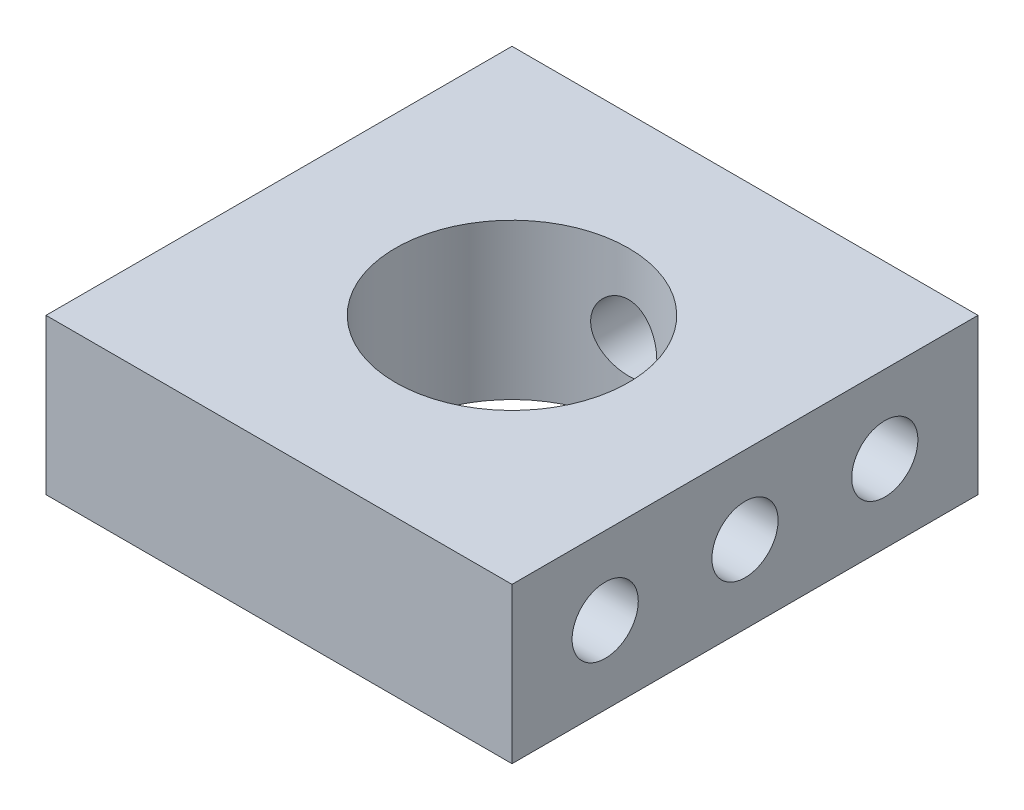
ISO-10303-21;
HEADER;
FILE_DESCRIPTION(('STEP AP214'),'2;1');
FILE_NAME('part.step','',(''),(''),'','','');
FILE_SCHEMA(('AUTOMOTIVE_DESIGN { 1 0 10303 214 1 1 1 1 }'));
ENDSEC;
DATA;
#1=APPLICATION_CONTEXT('core data for automotive mechanical design processes');
#2=APPLICATION_PROTOCOL_DEFINITION('international standard','automotive_design',2000,#1);
#3=PRODUCT_CONTEXT('',#1,'mechanical');
#4=PRODUCT('Part','Part','',(#3));
#5=PRODUCT_RELATED_PRODUCT_CATEGORY('part','',(#4));
#6=PRODUCT_DEFINITION_FORMATION('','',#4);
#7=PRODUCT_DEFINITION_CONTEXT('part definition',#1,'design');
#8=PRODUCT_DEFINITION('design','',#6,#7);
#9=PRODUCT_DEFINITION_SHAPE('','',#8);
#10=(LENGTH_UNIT() NAMED_UNIT(*) SI_UNIT(.MILLI.,.METRE.));
#11=(NAMED_UNIT(*) PLANE_ANGLE_UNIT() SI_UNIT($,.RADIAN.));
#12=(NAMED_UNIT(*) SI_UNIT($,.STERADIAN.) SOLID_ANGLE_UNIT());
#13=UNCERTAINTY_MEASURE_WITH_UNIT(LENGTH_MEASURE(1.E-05),#10,'distance_accuracy_value','');
#14=(GEOMETRIC_REPRESENTATION_CONTEXT(3) GLOBAL_UNCERTAINTY_ASSIGNED_CONTEXT((#13)) GLOBAL_UNIT_ASSIGNED_CONTEXT((#10,
#11,#12)) REPRESENTATION_CONTEXT('',''));
#15=CARTESIAN_POINT('',(0.,0.,0.));
#16=DIRECTION('',(0.,0.,1.));
#17=DIRECTION('',(1.,0.,0.));
#18=AXIS2_PLACEMENT_3D('',#15,#16,#17);
#19=CARTESIAN_POINT('',(9.525,6.35,3.94538418160373));
#20=DIRECTION('',(-1.,0.,0.));
#21=DIRECTION('',(0.,0.,1.));
#22=AXIS2_PLACEMENT_3D('',#19,#20,#21);
#23=PLANE('',#22);
#24=CARTESIAN_POINT('',(9.525,3.175,-5.715));
#25=DIRECTION('',(1.,0.,0.));
#26=DIRECTION('',(0.,0.,-1.));
#27=AXIS2_PLACEMENT_3D('',#24,#25,#26);
#28=CIRCLE('',#27,1.35254999999999);
#29=CARTESIAN_POINT('',(9.525,3.175,-7.06754999999999));
#30=VERTEX_POINT('',#29);
#31=EDGE_CURVE('E126',#30,#30,#28,.T.);
#32=ORIENTED_EDGE('',*,*,#31,.F.);
#33=EDGE_LOOP('',(#32));
#34=FACE_BOUND('',#33,.T.);
#35=CARTESIAN_POINT('',(9.525,3.175,5.715));
#36=DIRECTION('',(1.,0.,0.));
#37=DIRECTION('',(0.,0.,-1.));
#38=AXIS2_PLACEMENT_3D('',#35,#36,#37);
#39=CIRCLE('',#38,1.35254999999999);
#40=CARTESIAN_POINT('',(9.525,3.175,4.36245000000001));
#41=VERTEX_POINT('',#40);
#42=EDGE_CURVE('E134',#41,#41,#39,.T.);
#43=ORIENTED_EDGE('',*,*,#42,.F.);
#44=EDGE_LOOP('',(#43));
#45=FACE_BOUND('',#44,.T.);
#46=DIRECTION('',(0.,0.,-1.));
#47=VECTOR('',#46,1.);
#48=CARTESIAN_POINT('',(9.525,0.,3.94538418160373));
#49=LINE('',#48,#47);
#50=CARTESIAN_POINT('',(9.525,0.,9.525));
#51=VERTEX_POINT('',#50);
#52=CARTESIAN_POINT('',(9.525,0.,-9.525));
#53=VERTEX_POINT('',#52);
#54=EDGE_CURVE('E247',#51,#53,#49,.T.);
#55=ORIENTED_EDGE('',*,*,#54,.T.);
#56=DIRECTION('',(0.,-1.,0.));
#57=VECTOR('',#56,1.);
#58=CARTESIAN_POINT('',(9.525,6.35,-9.525));
#59=LINE('',#58,#57);
#60=CARTESIAN_POINT('',(9.525,6.35,-9.525));
#61=VERTEX_POINT('',#60);
#62=EDGE_CURVE('E53',#61,#53,#59,.T.);
#63=ORIENTED_EDGE('',*,*,#62,.F.);
#64=DIRECTION('',(0.,0.,-1.));
#65=VECTOR('',#64,1.);
#66=CARTESIAN_POINT('',(9.525,6.35,9.525));
#67=LINE('',#66,#65);
#68=CARTESIAN_POINT('',(9.525,6.35,9.525));
#69=VERTEX_POINT('',#68);
#70=EDGE_CURVE('E236',#69,#61,#67,.T.);
#71=ORIENTED_EDGE('',*,*,#70,.F.);
#72=DIRECTION('',(0.,-1.,0.));
#73=VECTOR('',#72,1.);
#74=CARTESIAN_POINT('',(9.525,6.35,9.525));
#75=LINE('',#74,#73);
#76=EDGE_CURVE('E11',#69,#51,#75,.T.);
#77=ORIENTED_EDGE('',*,*,#76,.T.);
#78=EDGE_LOOP('',(#55,#63,#71,#77));
#79=FACE_BOUND('',#78,.T.);
#80=CARTESIAN_POINT('',(9.525,3.175,0.));
#81=DIRECTION('',(1.,0.,0.));
#82=DIRECTION('',(0.,0.,-1.));
#83=AXIS2_PLACEMENT_3D('',#80,#81,#82);
#84=CIRCLE('',#83,1.35254999999999);
#85=CARTESIAN_POINT('',(9.525,3.175,-1.35254999999999));
#86=VERTEX_POINT('',#85);
#87=EDGE_CURVE('E142',#86,#86,#84,.T.);
#88=ORIENTED_EDGE('',*,*,#87,.F.);
#89=EDGE_LOOP('',(#88));
#90=FACE_BOUND('',#89,.T.);
#91=ADVANCED_FACE('F43',(#34,#45,#79,#90),#23,.F.);
#92=CARTESIAN_POINT('',(0.,6.35,0.));
#93=DIRECTION('',(0.,1.,0.));
#94=DIRECTION('',(0.,0.,1.));
#95=AXIS2_PLACEMENT_3D('',#92,#93,#94);
#96=PLANE('',#95);
#97=DIRECTION('',(1.,0.,0.));
#98=VECTOR('',#97,1.);
#99=CARTESIAN_POINT('',(-9.525,6.35,9.525));
#100=LINE('',#99,#98);
#101=CARTESIAN_POINT('',(-9.525,6.35,9.525));
#102=VERTEX_POINT('',#101);
#103=EDGE_CURVE('E87',#102,#69,#100,.T.);
#104=ORIENTED_EDGE('',*,*,#103,.T.);
#105=ORIENTED_EDGE('',*,*,#70,.T.);
#106=DIRECTION('',(-1.,0.,0.));
#107=VECTOR('',#106,1.);
#108=CARTESIAN_POINT('',(9.525,6.35,-9.525));
#109=LINE('',#108,#107);
#110=CARTESIAN_POINT('',(-9.525,6.35,-9.525));
#111=VERTEX_POINT('',#110);
#112=EDGE_CURVE('E239',#61,#111,#109,.T.);
#113=ORIENTED_EDGE('',*,*,#112,.T.);
#114=DIRECTION('',(0.,0.,1.));
#115=VECTOR('',#114,1.);
#116=CARTESIAN_POINT('',(-9.525,6.35,-9.525));
#117=LINE('',#116,#115);
#118=EDGE_CURVE('E61',#111,#102,#117,.T.);
#119=ORIENTED_EDGE('',*,*,#118,.T.);
#120=EDGE_LOOP('',(#104,#105,#113,#119));
#121=FACE_BOUND('',#120,.T.);
#122=CARTESIAN_POINT('',(0.,6.35,0.));
#123=DIRECTION('',(0.,1.,0.));
#124=DIRECTION('',(0.,0.,1.));
#125=AXIS2_PLACEMENT_3D('',#122,#123,#124);
#126=CIRCLE('',#125,4.7625);
#127=CARTESIAN_POINT('',(0.,6.35,4.7625));
#128=VERTEX_POINT('',#127);
#129=EDGE_CURVE('E227',#128,#128,#126,.T.);
#130=ORIENTED_EDGE('',*,*,#129,.F.);
#131=EDGE_LOOP('',(#130));
#132=FACE_BOUND('',#131,.T.);
#133=ADVANCED_FACE('F193',(#121,#132),#96,.T.);
#134=CARTESIAN_POINT('',(0.,0.,0.));
#135=DIRECTION('',(0.,1.,0.));
#136=DIRECTION('',(0.,0.,1.));
#137=AXIS2_PLACEMENT_3D('',#134,#135,#136);
#138=PLANE('',#137);
#139=DIRECTION('',(1.,0.,0.));
#140=VECTOR('',#139,1.);
#141=CARTESIAN_POINT('',(3.94538418160373,0.,9.525));
#142=LINE('',#141,#140);
#143=CARTESIAN_POINT('',(-9.525,0.,9.525));
#144=VERTEX_POINT('',#143);
#145=EDGE_CURVE('E83',#144,#51,#142,.T.);
#146=ORIENTED_EDGE('',*,*,#145,.F.);
#147=DIRECTION('',(0.,0.,1.));
#148=VECTOR('',#147,1.);
#149=CARTESIAN_POINT('',(-9.525,0.,3.94538418160374));
#150=LINE('',#149,#148);
#151=CARTESIAN_POINT('',(-9.525,0.,-9.525));
#152=VERTEX_POINT('',#151);
#153=EDGE_CURVE('E79',#152,#144,#150,.T.);
#154=ORIENTED_EDGE('',*,*,#153,.F.);
#155=DIRECTION('',(-1.,0.,0.));
#156=VECTOR('',#155,1.);
#157=CARTESIAN_POINT('',(9.525,0.,-9.525));
#158=LINE('',#157,#156);
#159=EDGE_CURVE('E250',#53,#152,#158,.T.);
#160=ORIENTED_EDGE('',*,*,#159,.F.);
#161=ORIENTED_EDGE('',*,*,#54,.F.);
#162=EDGE_LOOP('',(#146,#154,#160,#161));
#163=FACE_BOUND('',#162,.T.);
#164=CARTESIAN_POINT('',(0.,0.,0.));
#165=DIRECTION('',(0.,1.,0.));
#166=DIRECTION('',(0.,0.,1.));
#167=AXIS2_PLACEMENT_3D('',#164,#165,#166);
#168=CIRCLE('',#167,4.7625);
#169=CARTESIAN_POINT('',(0.,0.,4.7625));
#170=VERTEX_POINT('',#169);
#171=EDGE_CURVE('E226',#170,#170,#168,.T.);
#172=ORIENTED_EDGE('',*,*,#171,.T.);
#173=EDGE_LOOP('',(#172));
#174=FACE_BOUND('',#173,.T.);
#175=ADVANCED_FACE('F198',(#163,#174),#138,.F.);
#176=CARTESIAN_POINT('',(3.94538418160373,6.35,9.525));
#177=DIRECTION('',(0.,0.,-1.));
#178=DIRECTION('',(-1.,0.,0.));
#179=AXIS2_PLACEMENT_3D('',#176,#177,#178);
#180=PLANE('',#179);
#181=ORIENTED_EDGE('',*,*,#145,.T.);
#182=ORIENTED_EDGE('',*,*,#76,.F.);
#183=ORIENTED_EDGE('',*,*,#103,.F.);
#184=DIRECTION('',(0.,-1.,0.));
#185=VECTOR('',#184,1.);
#186=CARTESIAN_POINT('',(-9.525,6.35,9.525));
#187=LINE('',#186,#185);
#188=EDGE_CURVE('E244',#102,#144,#187,.T.);
#189=ORIENTED_EDGE('',*,*,#188,.T.);
#190=EDGE_LOOP('',(#181,#182,#183,#189));
#191=FACE_BOUND('',#190,.T.);
#192=ADVANCED_FACE('F45',(#191),#180,.F.);
#193=CARTESIAN_POINT('',(9.525,6.35,-9.525));
#194=DIRECTION('',(0.,0.,1.));
#195=DIRECTION('',(1.,0.,0.));
#196=AXIS2_PLACEMENT_3D('',#193,#194,#195);
#197=PLANE('',#196);
#198=CARTESIAN_POINT('',(0.,3.175,-9.525));
#199=DIRECTION('',(0.,0.,-1.));
#200=DIRECTION('',(-1.,0.,0.));
#201=AXIS2_PLACEMENT_3D('',#198,#199,#200);
#202=CIRCLE('',#201,1.35255);
#203=CARTESIAN_POINT('',(-1.35255,3.175,-9.525));
#204=VERTEX_POINT('',#203);
#205=EDGE_CURVE('E155',#204,#204,#202,.T.);
#206=ORIENTED_EDGE('',*,*,#205,.F.);
#207=EDGE_LOOP('',(#206));
#208=FACE_BOUND('',#207,.T.);
#209=ORIENTED_EDGE('',*,*,#159,.T.);
#210=DIRECTION('',(0.,-1.,0.));
#211=VECTOR('',#210,1.);
#212=CARTESIAN_POINT('',(-9.525,6.35,-9.525));
#213=LINE('',#212,#211);
#214=EDGE_CURVE('E258',#111,#152,#213,.T.);
#215=ORIENTED_EDGE('',*,*,#214,.F.);
#216=ORIENTED_EDGE('',*,*,#112,.F.);
#217=ORIENTED_EDGE('',*,*,#62,.T.);
#218=EDGE_LOOP('',(#209,#215,#216,#217));
#219=FACE_BOUND('',#218,.T.);
#220=ADVANCED_FACE('F203',(#208,#219),#197,.F.);
#221=CARTESIAN_POINT('',(-9.525,6.35,3.94538418160374));
#222=DIRECTION('',(1.,0.,0.));
#223=DIRECTION('',(0.,0.,-1.));
#224=AXIS2_PLACEMENT_3D('',#221,#222,#223);
#225=PLANE('',#224);
#226=CARTESIAN_POINT('',(-9.525,3.175,5.715));
#227=DIRECTION('',(-1.,0.,0.));
#228=DIRECTION('',(0.,0.,1.));
#229=AXIS2_PLACEMENT_3D('',#226,#227,#228);
#230=CIRCLE('',#229,1.35254999999999);
#231=CARTESIAN_POINT('',(-9.525,3.175,7.06754999999999));
#232=VERTEX_POINT('',#231);
#233=EDGE_CURVE('E113',#232,#232,#230,.T.);
#234=ORIENTED_EDGE('',*,*,#233,.F.);
#235=EDGE_LOOP('',(#234));
#236=FACE_BOUND('',#235,.T.);
#237=CARTESIAN_POINT('',(-9.525,3.175,-5.715));
#238=DIRECTION('',(-1.,0.,0.));
#239=DIRECTION('',(0.,0.,1.));
#240=AXIS2_PLACEMENT_3D('',#237,#238,#239);
#241=CIRCLE('',#240,1.35254999999999);
#242=CARTESIAN_POINT('',(-9.525,3.175,-4.36245000000001));
#243=VERTEX_POINT('',#242);
#244=EDGE_CURVE('E112',#243,#243,#241,.T.);
#245=ORIENTED_EDGE('',*,*,#244,.F.);
#246=EDGE_LOOP('',(#245));
#247=FACE_BOUND('',#246,.T.);
#248=ORIENTED_EDGE('',*,*,#153,.T.);
#249=ORIENTED_EDGE('',*,*,#188,.F.);
#250=ORIENTED_EDGE('',*,*,#118,.F.);
#251=ORIENTED_EDGE('',*,*,#214,.T.);
#252=EDGE_LOOP('',(#248,#249,#250,#251));
#253=FACE_BOUND('',#252,.T.);
#254=ADVANCED_FACE('F206',(#236,#247,#253),#225,.F.);
#255=CARTESIAN_POINT('',(0.,6.35,0.));
#256=DIRECTION('',(0.,-1.,0.));
#257=DIRECTION('',(0.,0.,-1.));
#258=AXIS2_PLACEMENT_3D('',#255,#256,#257);
#259=CYLINDRICAL_SURFACE('',#258,4.7625);
#260=CARTESIAN_POINT('',(4.56640063370485,3.175,-1.35254999999999));
#261=CARTESIAN_POINT('',(4.56640170110903,3.10068975455402,-1.35254861580889));
#262=CARTESIAN_POINT('',(4.56823438267173,3.02636546638733,-1.34640514603427));
#263=CARTESIAN_POINT('',(4.57534149984701,2.87987678755445,-1.32204854036095));
#264=CARTESIAN_POINT('',(4.58061736515387,2.80771330713241,-1.3038303907103));
#265=CARTESIAN_POINT('',(4.59396618493402,2.66768717260545,-1.2559824343459));
#266=CARTESIAN_POINT('',(4.60203484348498,2.59981810132559,-1.2263701465237));
#267=CARTESIAN_POINT('',(4.62005447292155,2.46999739220027,-1.15663082703141));
#268=CARTESIAN_POINT('',(4.63000566026733,2.40804643607575,-1.11650258599324));
#269=CARTESIAN_POINT('',(4.65098550523228,2.29006360263237,-1.02565266091116));
#270=CARTESIAN_POINT('',(4.66203525945541,2.23422441456472,-0.97468555693714));
#271=CARTESIAN_POINT('',(4.68378608654542,2.13176005069911,-0.864131554174427));
#272=CARTESIAN_POINT('',(4.69448711891384,2.08513594192282,-0.804543658559054));
#273=CARTESIAN_POINT('',(4.71457234983669,2.00160494551071,-0.677085864911765));
#274=CARTESIAN_POINT('',(4.72392877521853,1.96489210833667,-0.609084035352393));
#275=CARTESIAN_POINT('',(4.74002697829147,1.90349561110014,-0.467561913944271));
#276=CARTESIAN_POINT('',(4.74676925862135,1.8788096383192,-0.3940426862098));
#277=CARTESIAN_POINT('',(4.7567302793302,1.84279834247585,-0.245586420007764));
#278=CARTESIAN_POINT('',(4.76003546150067,1.83114466139399,-0.170734935147037));
#279=CARTESIAN_POINT('',(4.76305321988918,1.82049304957946,-0.0200711654661538));
#280=CARTESIAN_POINT('',(4.76276647492178,1.82149272757254,0.0557409351082964));
#281=CARTESIAN_POINT('',(4.75869489631409,1.83589369621008,0.203879289622465));
#282=CARTESIAN_POINT('',(4.75501024663085,1.84893982308791,0.276243250670253));
#283=CARTESIAN_POINT('',(4.74467686711358,1.88648635538632,0.417709011336021));
#284=CARTESIAN_POINT('',(4.7380279578798,1.9109874540769,0.486810613233008));
#285=CARTESIAN_POINT('',(4.72236967204045,1.9710043710628,0.620665033726602));
#286=CARTESIAN_POINT('',(4.71333547539232,2.00663677546419,0.685362555118473));
#287=CARTESIAN_POINT('',(4.6938724600643,2.0878140344687,0.807977279711239));
#288=CARTESIAN_POINT('',(4.68344333900652,2.13336103960784,0.865893007702631));
#289=CARTESIAN_POINT('',(4.66188669442927,2.23493843646873,0.975420507985117));
#290=CARTESIAN_POINT('',(4.65074749366608,2.29127767823421,1.02674391113113));
#291=CARTESIAN_POINT('',(4.62934745511477,2.41187586059605,1.1192902785718));
#292=CARTESIAN_POINT('',(4.61908668687878,2.4761354273233,1.16051244355562));
#293=CARTESIAN_POINT('',(4.6005536482296,2.61144267002226,1.23194597232205));
#294=CARTESIAN_POINT('',(4.59229752402104,2.6825394150799,1.26206888067419));
#295=CARTESIAN_POINT('',(4.57890391531724,2.82908308201907,1.30983492290815));
#296=CARTESIAN_POINT('',(4.57376553610945,2.90452874906003,1.32748163737678));
#297=CARTESIAN_POINT('',(4.56738278049193,3.05490732307405,1.34927620380854));
#298=CARTESIAN_POINT('',(4.56601316821163,3.12977202860506,1.35385838351382));
#299=CARTESIAN_POINT('',(4.56697849575813,3.27920008142574,1.350598734021));
#300=CARTESIAN_POINT('',(4.56931297991677,3.35376346465207,1.34275843300385));
#301=CARTESIAN_POINT('',(4.57730148693832,3.49872989807692,1.31526134577482));
#302=CARTESIAN_POINT('',(4.58287947907535,3.56918884533178,1.29587496560654));
#303=CARTESIAN_POINT('',(4.59664993813311,3.70585241130436,1.24614483842484));
#304=CARTESIAN_POINT('',(4.60484277908873,3.77205641975578,1.21579952373472));
#305=CARTESIAN_POINT('',(4.62316962866317,3.90012232441812,1.14416076222796));
#306=CARTESIAN_POINT('',(4.63334626609143,3.96183815926422,1.10261737496508));
#307=CARTESIAN_POINT('',(4.6543982760526,4.07758176848037,1.01006488194862));
#308=CARTESIAN_POINT('',(4.66527379783884,4.13160789266755,0.959053749847739));
#309=CARTESIAN_POINT('',(4.68693671199153,4.23229015073669,0.846987959883301));
#310=CARTESIAN_POINT('',(4.69770909864655,4.2786408031282,0.785655326387741));
#311=CARTESIAN_POINT('',(4.71758373932684,4.36039397890161,0.655832022435879));
#312=CARTESIAN_POINT('',(4.72668608096351,4.39579707666454,0.587341727770117));
#313=CARTESIAN_POINT('',(4.74213695033473,4.45431304097172,0.44562283460629));
#314=CARTESIAN_POINT('',(4.74850625117361,4.47751893044617,0.372435022288982));
#315=CARTESIAN_POINT('',(4.75786512178737,4.51123791470285,0.222987788750546));
#316=CARTESIAN_POINT('',(4.76085554968583,4.5217542322688,0.14672915251611));
#317=CARTESIAN_POINT('',(4.76307323302731,4.52957147863081,-0.00385729695052099));
#318=CARTESIAN_POINT('',(4.76242732195781,4.52731779964328,-0.0781604271236372));
#319=CARTESIAN_POINT('',(4.7577378681294,4.51070866161681,-0.225286032097937));
#320=CARTESIAN_POINT('',(4.7536944846933,4.49635377005831,-0.298108576166484));
#321=CARTESIAN_POINT('',(4.74269532931058,4.45621430754866,-0.439594476876525));
#322=CARTESIAN_POINT('',(4.73576531811087,4.43053071916091,-0.508288619761361));
#323=CARTESIAN_POINT('',(4.71971292383407,4.36855274042241,-0.640430762275762));
#324=CARTESIAN_POINT('',(4.71059020407157,4.33225672037148,-0.703877954235129));
#325=CARTESIAN_POINT('',(4.69078488561701,4.24884071316122,-0.82575430619519));
#326=CARTESIAN_POINT('',(4.68006424771654,4.20143332994458,-0.883980546503699));
#327=CARTESIAN_POINT('',(4.65840821299416,4.09767131241393,-0.991801184959506));
#328=CARTESIAN_POINT('',(4.64747275784621,4.04131421785626,-1.04139320170823));
#329=CARTESIAN_POINT('',(4.626295757259,3.91950095679387,-1.13181737034728));
#330=CARTESIAN_POINT('',(4.61607947194611,3.85384716350096,-1.17238980416485));
#331=CARTESIAN_POINT('',(4.59787655200008,3.71636864395042,-1.2418677215508));
#332=CARTESIAN_POINT('',(4.5898886502276,3.64454745521003,-1.27077983978156));
#333=CARTESIAN_POINT('',(4.57799690640778,3.50680427643752,-1.31292098259455));
#334=CARTESIAN_POINT('',(4.57368638825519,3.44140121762872,-1.32774401138577));
#335=CARTESIAN_POINT('',(4.56788798702275,3.30900241472805,-1.34755839051794));
#336=CARTESIAN_POINT('',(4.56639967120684,3.24200691640468,-1.3525512481506));
#337=CARTESIAN_POINT('',(4.56640063370485,3.175,-1.35254999999999));
#338=B_SPLINE_CURVE_WITH_KNOTS('',3,(#260,#261,#262,#263,#264,#265,#266,#267,#268,#269,#270,
#271,#272,#273,#274,#275,#276,#277,#278,#279,#280,#281,#282,#283,#284,#285,#286,#287,#288,#289,
#290,#291,#292,#293,#294,#295,#296,#297,#298,#299,#300,#301,#302,#303,#304,#305,#306,#307,#308,
#309,#310,#311,#312,#313,#314,#315,#316,#317,#318,#319,#320,#321,#322,#323,#324,#325,#326,#327,
#328,#329,#330,#331,#332,#333,#334,#335,#336,#337),.UNSPECIFIED.,.T.,.F.,(4,2,2,2,2,2,2,2,2,2,2,
2,2,2,2,2,2,2,2,2,2,2,2,2,2,2,2,2,2,2,2,2,2,2,2,2,2,2,4),(0.,0.222683955827818,
0.445460434371463,0.667895746119747,0.890356649870891,1.11852626653287,1.34672228768602,
1.5791065058643,1.81144601982123,2.03778953600667,2.26409027767398,2.48392499482254,
2.70377301838039,2.92600556941737,3.14828637213764,3.37827786679128,3.60828755479596,
3.84009256619206,4.07183102401665,4.29577011256107,4.51968165484572,4.73854477397855,
4.95743921391211,5.18169485524017,5.40599854865826,5.63777465892272,5.86953860661723,
6.09950835682952,6.32941968908501,6.5513626580728,6.77329521973292,6.99328826883899,
7.21331511898053,7.43982454272073,7.66639634122326,7.89882776303315,8.13112674528155,
8.33195576412371,8.53275398680844),.UNSPECIFIED.);
#339=CARTESIAN_POINT('',(4.56640063370485,3.175,-1.35254999999999));
#340=VERTEX_POINT('',#339);
#341=EDGE_CURVE('E146',#340,#340,#338,.T.);
#342=ORIENTED_EDGE('',*,*,#341,.F.);
#343=EDGE_LOOP('',(#342));
#344=FACE_BOUND('',#343,.T.);
#345=CARTESIAN_POINT('',(0.,4.52755,-4.7625));
#346=CARTESIAN_POINT('',(-0.0743784999581474,4.5275486430201,-4.7624990905622));
#347=CARTESIAN_POINT('',(-0.148770997363666,4.52139427786597,-4.76074068414839));
#348=CARTESIAN_POINT('',(-0.29540104844341,4.49699047829311,-4.75389731213497));
#349=CARTESIAN_POINT('',(-0.367637754898103,4.47873635244937,-4.74881105624237));
#350=CARTESIAN_POINT('',(-0.507819372462201,4.43078329715905,-4.73587132206403));
#351=CARTESIAN_POINT('',(-0.575770075173448,4.40110021454008,-4.72802167664354));
#352=CARTESIAN_POINT('',(-0.705729564095678,4.33119378181307,-4.710377746781));
#353=CARTESIAN_POINT('',(-0.767737748085329,4.29096936497405,-4.70058326555549));
#354=CARTESIAN_POINT('',(-0.885664511249006,4.20001870977713,-4.67981587709255));
#355=CARTESIAN_POINT('',(-0.941406614739934,4.14906872941423,-4.66882075569231));
#356=CARTESIAN_POINT('',(-1.04368118906315,4.03859076612216,-4.64702871784162));
#357=CARTESIAN_POINT('',(-1.09021229789723,3.97906151685142,-4.63623183091725));
#358=CARTESIAN_POINT('',(-1.17363874376928,3.85166351744424,-4.61582763733192));
#359=CARTESIAN_POINT('',(-1.21032481599622,3.78365286087308,-4.60624815020734));
#360=CARTESIAN_POINT('',(-1.27166948775741,3.64211211694877,-4.58969276319239));
#361=CARTESIAN_POINT('',(-1.29633063999,3.56858320486075,-4.58271631079326));
#362=CARTESIAN_POINT('',(-1.3323006220351,3.42006189795207,-4.57238733366614));
#363=CARTESIAN_POINT('',(-1.34393220362154,3.34515390446938,-4.56894739365361));
#364=CARTESIAN_POINT('',(-1.35451996418055,3.1943768560357,-4.56582030437458));
#365=CARTESIAN_POINT('',(-1.35347886096571,3.11850801063768,-4.5661323504485));
#366=CARTESIAN_POINT('',(-1.33900564806272,2.97053442802031,-4.57039612187765));
#367=CARTESIAN_POINT('',(-1.32597092922696,2.89838691263082,-4.57423111302579));
#368=CARTESIAN_POINT('',(-1.28851978726118,2.75734778962324,-4.58492077482652));
#369=CARTESIAN_POINT('',(-1.26410234621991,2.688456473801,-4.59177571553807));
#370=CARTESIAN_POINT('',(-1.20427101589375,2.55488196332034,-4.60783068706061));
#371=CARTESIAN_POINT('',(-1.16872313756866,2.49026233362383,-4.61705903338387));
#372=CARTESIAN_POINT('',(-1.08773328002495,2.36776901838411,-4.63680661480737));
#373=CARTESIAN_POINT('',(-1.04228912138712,2.30989682311937,-4.64732613403455));
#374=CARTESIAN_POINT('',(-0.940794256967903,2.20027881637208,-4.66895040089115));
#375=CARTESIAN_POINT('',(-0.88441177661857,2.14884113440109,-4.68006235899327));
#376=CARTESIAN_POINT('',(-0.763683506834271,2.056083587976,-4.701270538666));
#377=CARTESIAN_POINT('',(-0.699337314715697,2.01476423546827,-4.71136670882664));
#378=CARTESIAN_POINT('',(-0.5639892213758,1.94325494809201,-4.72948235962791));
#379=CARTESIAN_POINT('',(-0.492952838256662,1.91312712835502,-4.73749017851947));
#380=CARTESIAN_POINT('',(-0.346542575324879,1.86533374841148,-4.75044281323286));
#381=CARTESIAN_POINT('',(-0.271169780302289,1.8476650859767,-4.75538839149013));
#382=CARTESIAN_POINT('',(-0.120850696904539,1.8257900941737,-4.76154131476189));
#383=CARTESIAN_POINT('',(-0.0459699308038011,1.82116553193465,-4.76286475366233));
#384=CARTESIAN_POINT('',(0.10349956640034,1.82434628148552,-4.76196150939729));
#385=CARTESIAN_POINT('',(0.178088331040754,1.8321501211997,-4.75973524667437));
#386=CARTESIAN_POINT('',(0.323320333171316,1.85962538244712,-4.75205828854765));
#387=CARTESIAN_POINT('',(0.394012520550827,1.8790578995256,-4.74667254553646));
#388=CARTESIAN_POINT('',(0.531122495891908,1.92895641763358,-4.73329318241284));
#389=CARTESIAN_POINT('',(0.597539791066201,1.95942368801873,-4.72529926228568));
#390=CARTESIAN_POINT('',(0.725796270146899,2.03126494247286,-4.70732543764485));
#391=CARTESIAN_POINT('',(0.787506578464486,2.07285900781803,-4.6973065860586));
#392=CARTESIAN_POINT('',(0.903216277264467,2.16550128896996,-4.67643766201817));
#393=CARTESIAN_POINT('',(0.957213930011425,2.21655162943405,-4.66558740308336));
#394=CARTESIAN_POINT('',(1.0577689096824,2.32861713337727,-4.64384180185687));
#395=CARTESIAN_POINT('',(1.10402970104661,2.38990082578654,-4.6329563160084));
#396=CARTESIAN_POINT('',(1.18562443626754,2.51959581025901,-4.61275127903121));
#397=CARTESIAN_POINT('',(1.22095876925182,2.58800684837768,-4.60343167214173));
#398=CARTESIAN_POINT('',(1.27943864976603,2.72972431512764,-4.58752245180626));
#399=CARTESIAN_POINT('',(1.3026495237019,2.80300205720859,-4.58091824850396));
#400=CARTESIAN_POINT('',(1.33634832071343,2.95264418491538,-4.5712025660945));
#401=CARTESIAN_POINT('',(1.34684004147844,3.02900764216698,-4.5680900444605));
#402=CARTESIAN_POINT('',(1.35456349369031,3.17959566461426,-4.56580529583762));
#403=CARTESIAN_POINT('',(1.35227511990277,3.25379379693445,-4.56649045772405));
#404=CARTESIAN_POINT('',(1.33563291667447,3.40069987613526,-4.57138541209335));
#405=CARTESIAN_POINT('',(1.32127948086557,3.47340787155346,-4.57559508958619));
#406=CARTESIAN_POINT('',(1.28120938194407,3.61457466494029,-4.58697424833289));
#407=CARTESIAN_POINT('',(1.25560725829135,3.68306855721659,-4.5941138485776));
#408=CARTESIAN_POINT('',(1.19385511761934,3.81484262392982,-4.61054579052911));
#409=CARTESIAN_POINT('',(1.15770325253401,3.87812188239307,-4.61983850935274));
#410=CARTESIAN_POINT('',(1.07447772612258,3.9999291052839,-4.63991281967711));
#411=CARTESIAN_POINT('',(1.02708281091477,4.05823115248444,-4.65073344512606));
#412=CARTESIAN_POINT('',(0.923310873670471,4.1662102271965,-4.67244141501305));
#413=CARTESIAN_POINT('',(0.866931600829682,4.21588508684919,-4.68332877551092));
#414=CARTESIAN_POINT('',(0.745075103274017,4.30644175885675,-4.70427270151549));
#415=CARTESIAN_POINT('',(0.679404116686309,4.34706990505124,-4.71430135163212));
#416=CARTESIAN_POINT('',(0.54187924853466,4.41664775838159,-4.73207848194561));
#417=CARTESIAN_POINT('',(0.47002882829272,4.44560395236433,-4.73982822802492));
#418=CARTESIAN_POINT('',(0.332182453383483,4.48782989682263,-4.751335030315));
#419=CARTESIAN_POINT('',(0.266702044494608,4.50268750874605,-4.75548935771175));
#420=CARTESIAN_POINT('',(0.134151413500937,4.52254753056349,-4.76107207516973));
#421=CARTESIAN_POINT('',(0.0670813995808878,4.52755122384977,-4.76250082021498));
#422=CARTESIAN_POINT('',(0.,4.52755,-4.7625));
#423=B_SPLINE_CURVE_WITH_KNOTS('',3,(#345,#346,#347,#348,#349,#350,#351,#352,#353,#354,#355,
#356,#357,#358,#359,#360,#361,#362,#363,#364,#365,#366,#367,#368,#369,#370,#371,#372,#373,#374,
#375,#376,#377,#378,#379,#380,#381,#382,#383,#384,#385,#386,#387,#388,#389,#390,#391,#392,#393,
#394,#395,#396,#397,#398,#399,#400,#401,#402,#403,#404,#405,#406,#407,#408,#409,#410,#411,#412,
#413,#414,#415,#416,#417,#418,#419,#420,#421,#422),.UNSPECIFIED.,.T.,.F.,(4,2,2,2,2,2,2,2,2,2,2,
2,2,2,2,2,2,2,2,2,2,2,2,2,2,2,2,2,2,2,2,2,2,2,2,2,2,2,4),(0.,0.222889294304383,
0.445865059785244,0.66853276499121,0.891223011776168,1.11912484754546,1.34706035724664,
1.5795136457763,1.81191756668119,2.03842777803386,2.26488941235131,2.48410768184065,
2.70334555890311,2.92533126990746,3.14736591748721,3.3776632797834,3.60797229178431,
3.83954111207457,4.07105225324437,4.29505113405517,4.51902348540567,4.73854523915272,
4.95809225306818,5.18235198880407,5.40666217297807,5.63821506829868,5.86975971630009,
6.10004348477564,6.33025847809252,6.55188840440896,6.77351110016065,6.99292761660176,
7.21238259274194,7.43908482813347,7.66584394760145,7.89832815072563,8.13068296884128,
8.33173130329812,8.53275345112239),.UNSPECIFIED.);
#424=CARTESIAN_POINT('',(0.,4.52755,-4.7625));
#425=VERTEX_POINT('',#424);
#426=EDGE_CURVE('E219',#425,#425,#423,.T.);
#427=ORIENTED_EDGE('',*,*,#426,.F.);
#428=EDGE_LOOP('',(#427));
#429=FACE_BOUND('',#428,.T.);
#430=ORIENTED_EDGE('',*,*,#129,.T.);
#431=EDGE_LOOP('',(#430));
#432=FACE_BOUND('',#431,.T.);
#433=ORIENTED_EDGE('',*,*,#171,.F.);
#434=EDGE_LOOP('',(#433));
#435=FACE_BOUND('',#434,.T.);
#436=ADVANCED_FACE('F210',(#344,#429,#432,#435),#259,.F.);
#437=CARTESIAN_POINT('',(0.,3.175,-9.525));
#438=DIRECTION('',(0.,0.,-1.));
#439=DIRECTION('',(-1.,0.,0.));
#440=AXIS2_PLACEMENT_3D('',#437,#438,#439);
#441=CYLINDRICAL_SURFACE('',#440,1.35255);
#442=ORIENTED_EDGE('',*,*,#205,.T.);
#443=EDGE_LOOP('',(#442));
#444=FACE_BOUND('',#443,.T.);
#445=ORIENTED_EDGE('',*,*,#426,.T.);
#446=EDGE_LOOP('',(#445));
#447=FACE_BOUND('',#446,.T.);
#448=ADVANCED_FACE('F164',(#444,#447),#441,.F.);
#449=CARTESIAN_POINT('',(9.525,3.175,0.));
#450=DIRECTION('',(1.,0.,0.));
#451=DIRECTION('',(0.,0.,-1.));
#452=AXIS2_PLACEMENT_3D('',#449,#450,#451);
#453=CYLINDRICAL_SURFACE('',#452,1.35254999999999);
#454=ORIENTED_EDGE('',*,*,#87,.T.);
#455=EDGE_LOOP('',(#454));
#456=FACE_BOUND('',#455,.T.);
#457=ORIENTED_EDGE('',*,*,#341,.T.);
#458=EDGE_LOOP('',(#457));
#459=FACE_BOUND('',#458,.T.);
#460=ADVANCED_FACE('F159',(#456,#459),#453,.F.);
#461=CARTESIAN_POINT('',(3.98769403026573,3.175,5.715));
#462=DIRECTION('',(1.,0.,0.));
#463=DIRECTION('',(0.,0.,-1.));
#464=AXIS2_PLACEMENT_3D('',#461,#462,#463);
#465=CONICAL_SURFACE('',#464,1.35255,1.02974425867665);
#466=CARTESIAN_POINT('',(3.175,3.175,5.715));
#467=VERTEX_POINT('',#466);
#468=VERTEX_LOOP('',#467);
#469=FACE_BOUND('',#468,.T.);
#470=CARTESIAN_POINT('',(3.98769403026573,3.175,5.715));
#471=DIRECTION('',(1.,0.,0.));
#472=DIRECTION('',(0.,0.,-1.));
#473=AXIS2_PLACEMENT_3D('',#470,#471,#472);
#474=CIRCLE('',#473,1.35255);
#475=CARTESIAN_POINT('',(3.98769403026573,3.175,4.36245));
#476=VERTEX_POINT('',#475);
#477=EDGE_CURVE('E138',#476,#476,#474,.T.);
#478=ORIENTED_EDGE('',*,*,#477,.T.);
#479=EDGE_LOOP('',(#478));
#480=FACE_BOUND('',#479,.T.);
#481=ADVANCED_FACE('F163',(#469,#480),#465,.F.);
#482=CARTESIAN_POINT('',(9.525,3.175,5.715));
#483=DIRECTION('',(1.,0.,0.));
#484=DIRECTION('',(0.,0.,-1.));
#485=AXIS2_PLACEMENT_3D('',#482,#483,#484);
#486=CYLINDRICAL_SURFACE('',#485,1.35254999999999);
#487=ORIENTED_EDGE('',*,*,#477,.F.);
#488=EDGE_LOOP('',(#487));
#489=FACE_BOUND('',#488,.T.);
#490=ORIENTED_EDGE('',*,*,#42,.T.);
#491=EDGE_LOOP('',(#490));
#492=FACE_BOUND('',#491,.T.);
#493=ADVANCED_FACE('F168',(#489,#492),#486,.F.);
#494=CARTESIAN_POINT('',(3.98769403026573,3.175,-5.715));
#495=DIRECTION('',(1.,0.,0.));
#496=DIRECTION('',(0.,0.,-1.));
#497=AXIS2_PLACEMENT_3D('',#494,#495,#496);
#498=CONICAL_SURFACE('',#497,1.35255,1.02974425867665);
#499=CARTESIAN_POINT('',(3.175,3.175,-5.715));
#500=VERTEX_POINT('',#499);
#501=VERTEX_LOOP('',#500);
#502=FACE_BOUND('',#501,.T.);
#503=CARTESIAN_POINT('',(3.98769403026573,3.175,-5.715));
#504=DIRECTION('',(1.,0.,0.));
#505=DIRECTION('',(0.,0.,-1.));
#506=AXIS2_PLACEMENT_3D('',#503,#504,#505);
#507=CIRCLE('',#506,1.35255);
#508=CARTESIAN_POINT('',(3.98769403026573,3.175,-7.06755));
#509=VERTEX_POINT('',#508);
#510=EDGE_CURVE('E130',#509,#509,#507,.T.);
#511=ORIENTED_EDGE('',*,*,#510,.T.);
#512=EDGE_LOOP('',(#511));
#513=FACE_BOUND('',#512,.T.);
#514=ADVANCED_FACE('F172',(#502,#513),#498,.F.);
#515=CARTESIAN_POINT('',(9.525,3.175,-5.715));
#516=DIRECTION('',(1.,0.,0.));
#517=DIRECTION('',(0.,0.,-1.));
#518=AXIS2_PLACEMENT_3D('',#515,#516,#517);
#519=CYLINDRICAL_SURFACE('',#518,1.35254999999999);
#520=ORIENTED_EDGE('',*,*,#510,.F.);
#521=EDGE_LOOP('',(#520));
#522=FACE_BOUND('',#521,.T.);
#523=ORIENTED_EDGE('',*,*,#31,.T.);
#524=EDGE_LOOP('',(#523));
#525=FACE_BOUND('',#524,.T.);
#526=ADVANCED_FACE('F176',(#522,#525),#519,.F.);
#527=CARTESIAN_POINT('',(-3.98769403026573,3.175,-5.715));
#528=DIRECTION('',(-1.,0.,0.));
#529=DIRECTION('',(0.,0.,1.));
#530=AXIS2_PLACEMENT_3D('',#527,#528,#529);
#531=CONICAL_SURFACE('',#530,1.35255,1.02974425867665);
#532=CARTESIAN_POINT('',(-3.175,3.175,-5.715));
#533=VERTEX_POINT('',#532);
#534=VERTEX_LOOP('',#533);
#535=FACE_BOUND('',#534,.T.);
#536=CARTESIAN_POINT('',(-3.98769403026573,3.175,-5.715));
#537=DIRECTION('',(-1.,0.,0.));
#538=DIRECTION('',(0.,0.,1.));
#539=AXIS2_PLACEMENT_3D('',#536,#537,#538);
#540=CIRCLE('',#539,1.35255);
#541=CARTESIAN_POINT('',(-3.98769403026573,3.175,-4.36245));
#542=VERTEX_POINT('',#541);
#543=EDGE_CURVE('E118',#542,#542,#540,.T.);
#544=ORIENTED_EDGE('',*,*,#543,.T.);
#545=EDGE_LOOP('',(#544));
#546=FACE_BOUND('',#545,.T.);
#547=ADVANCED_FACE('F180',(#535,#546),#531,.F.);
#548=CARTESIAN_POINT('',(-9.525,3.175,-5.715));
#549=DIRECTION('',(-1.,0.,0.));
#550=DIRECTION('',(0.,0.,1.));
#551=AXIS2_PLACEMENT_3D('',#548,#549,#550);
#552=CYLINDRICAL_SURFACE('',#551,1.35254999999999);
#553=ORIENTED_EDGE('',*,*,#543,.F.);
#554=EDGE_LOOP('',(#553));
#555=FACE_BOUND('',#554,.T.);
#556=ORIENTED_EDGE('',*,*,#244,.T.);
#557=EDGE_LOOP('',(#556));
#558=FACE_BOUND('',#557,.T.);
#559=ADVANCED_FACE('F105',(#555,#558),#552,.F.);
#560=CARTESIAN_POINT('',(-3.98769403026573,3.175,5.715));
#561=DIRECTION('',(-1.,0.,0.));
#562=DIRECTION('',(0.,0.,1.));
#563=AXIS2_PLACEMENT_3D('',#560,#561,#562);
#564=CONICAL_SURFACE('',#563,1.35255,1.02974425867665);
#565=CARTESIAN_POINT('',(-3.175,3.175,5.715));
#566=VERTEX_POINT('',#565);
#567=VERTEX_LOOP('',#566);
#568=FACE_BOUND('',#567,.T.);
#569=CARTESIAN_POINT('',(-3.98769403026573,3.175,5.715));
#570=DIRECTION('',(-1.,0.,0.));
#571=DIRECTION('',(0.,0.,1.));
#572=AXIS2_PLACEMENT_3D('',#569,#570,#571);
#573=CIRCLE('',#572,1.35255);
#574=CARTESIAN_POINT('',(-3.98769403026573,3.175,7.06755));
#575=VERTEX_POINT('',#574);
#576=EDGE_CURVE('E109',#575,#575,#573,.T.);
#577=ORIENTED_EDGE('',*,*,#576,.T.);
#578=EDGE_LOOP('',(#577));
#579=FACE_BOUND('',#578,.T.);
#580=ADVANCED_FACE('F101',(#568,#579),#564,.F.);
#581=CARTESIAN_POINT('',(-9.525,3.175,5.715));
#582=DIRECTION('',(-1.,0.,0.));
#583=DIRECTION('',(0.,0.,1.));
#584=AXIS2_PLACEMENT_3D('',#581,#582,#583);
#585=CYLINDRICAL_SURFACE('',#584,1.35254999999999);
#586=ORIENTED_EDGE('',*,*,#576,.F.);
#587=EDGE_LOOP('',(#586));
#588=FACE_BOUND('',#587,.T.);
#589=ORIENTED_EDGE('',*,*,#233,.T.);
#590=EDGE_LOOP('',(#589));
#591=FACE_BOUND('',#590,.T.);
#592=ADVANCED_FACE('F104',(#588,#591),#585,.F.);
#593=CLOSED_SHELL('',(#91,#133,#175,#192,#220,#254,#436,#448,#460,#481,#493,#514,#526,#547,#559,
#580,#592));
#594=MANIFOLD_SOLID_BREP('B2',#593);
#595=ADVANCED_BREP_SHAPE_REPRESENTATION('',(#18,#594),#14);
#596=SHAPE_DEFINITION_REPRESENTATION(#9,#595);
ENDSEC;
END-ISO-10303-21;
